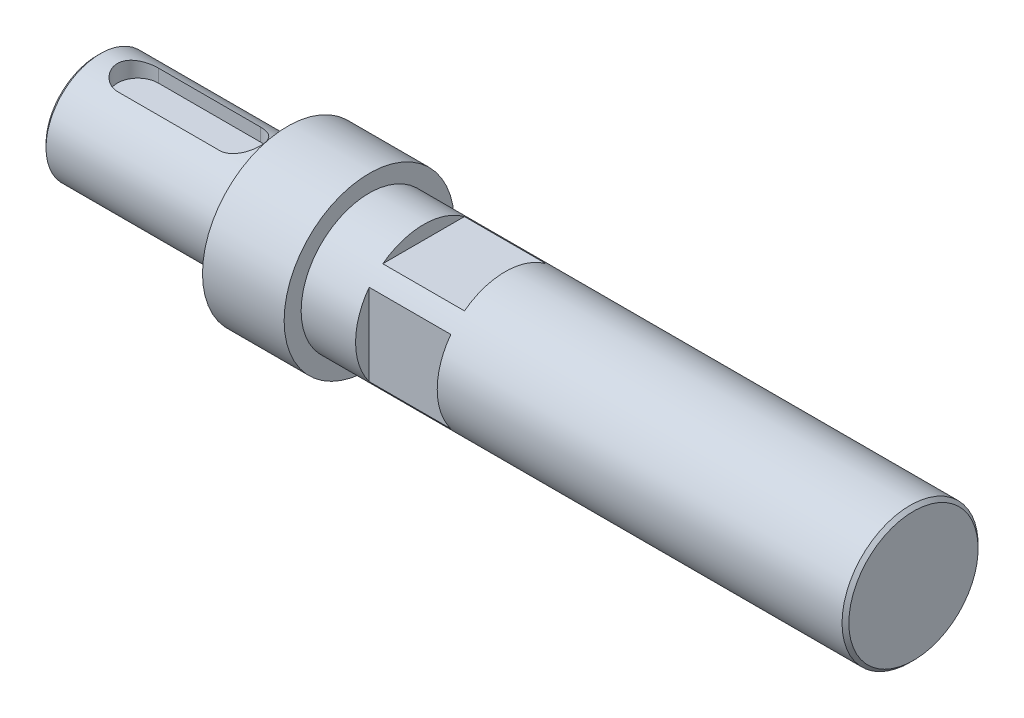
ISO-10303-21;
HEADER;
FILE_DESCRIPTION(('STEP AP214'),'2;1');
FILE_NAME('part.step','',(''),(''),'','','');
FILE_SCHEMA(('AUTOMOTIVE_DESIGN { 1 0 10303 214 1 1 1 1 }'));
ENDSEC;
DATA;
#1=APPLICATION_CONTEXT('core data for automotive mechanical design processes');
#2=APPLICATION_PROTOCOL_DEFINITION('international standard','automotive_design',2000,#1);
#3=PRODUCT_CONTEXT('',#1,'mechanical');
#4=PRODUCT('Part','Part','',(#3));
#5=PRODUCT_RELATED_PRODUCT_CATEGORY('part','',(#4));
#6=PRODUCT_DEFINITION_FORMATION('','',#4);
#7=PRODUCT_DEFINITION_CONTEXT('part definition',#1,'design');
#8=PRODUCT_DEFINITION('design','',#6,#7);
#9=PRODUCT_DEFINITION_SHAPE('','',#8);
#10=(LENGTH_UNIT() NAMED_UNIT(*) SI_UNIT(.MILLI.,.METRE.));
#11=(NAMED_UNIT(*) PLANE_ANGLE_UNIT() SI_UNIT($,.RADIAN.));
#12=(NAMED_UNIT(*) SI_UNIT($,.STERADIAN.) SOLID_ANGLE_UNIT());
#13=UNCERTAINTY_MEASURE_WITH_UNIT(LENGTH_MEASURE(1.E-05),#10,'distance_accuracy_value','');
#14=(GEOMETRIC_REPRESENTATION_CONTEXT(3) GLOBAL_UNCERTAINTY_ASSIGNED_CONTEXT((#13)) GLOBAL_UNIT_ASSIGNED_CONTEXT((#10,
#11,#12)) REPRESENTATION_CONTEXT('',''));
#15=CARTESIAN_POINT('',(0.,0.,0.));
#16=DIRECTION('',(0.,0.,1.));
#17=DIRECTION('',(1.,0.,0.));
#18=AXIS2_PLACEMENT_3D('',#15,#16,#17);
#19=CARTESIAN_POINT('',(0.,0.,0.));
#20=DIRECTION('',(-1.,0.,0.));
#21=DIRECTION('',(0.,0.,1.));
#22=AXIS2_PLACEMENT_3D('',#19,#20,#21);
#23=PLANE('',#22);
#24=CARTESIAN_POINT('',(0.,0.,0.));
#25=DIRECTION('',(-1.,0.,0.));
#26=DIRECTION('',(0.,0.,1.));
#27=AXIS2_PLACEMENT_3D('',#24,#25,#26);
#28=CIRCLE('',#27,19.);
#29=CARTESIAN_POINT('',(0.,0.,19.));
#30=VERTEX_POINT('',#29);
#31=EDGE_CURVE('E197',#30,#30,#28,.T.);
#32=ORIENTED_EDGE('',*,*,#31,.F.);
#33=EDGE_LOOP('',(#32));
#34=FACE_BOUND('',#33,.T.);
#35=ADVANCED_FACE('F35',(#34),#23,.F.);
#36=CARTESIAN_POINT('',(0.,0.,0.));
#37=DIRECTION('',(-1.,0.,0.));
#38=DIRECTION('',(0.,0.,1.));
#39=AXIS2_PLACEMENT_3D('',#36,#37,#38);
#40=CONICAL_SURFACE('',#39,19.,0.785398163397447);
#41=CARTESIAN_POINT('',(-1.,0.,0.));
#42=DIRECTION('',(-1.,0.,0.));
#43=DIRECTION('',(0.,0.,1.));
#44=AXIS2_PLACEMENT_3D('',#41,#42,#43);
#45=CIRCLE('',#44,20.);
#46=CARTESIAN_POINT('',(-1.,0.,20.));
#47=VERTEX_POINT('',#46);
#48=EDGE_CURVE('E194',#47,#47,#45,.T.);
#49=ORIENTED_EDGE('',*,*,#48,.F.);
#50=EDGE_LOOP('',(#49));
#51=FACE_BOUND('',#50,.T.);
#52=ORIENTED_EDGE('',*,*,#31,.T.);
#53=EDGE_LOOP('',(#52));
#54=FACE_BOUND('',#53,.T.);
#55=ADVANCED_FACE('F306',(#51,#54),#40,.T.);
#56=CARTESIAN_POINT('',(-178.322580645161,0.,0.));
#57=DIRECTION('',(-1.,0.,0.));
#58=DIRECTION('',(0.,0.,1.));
#59=AXIS2_PLACEMENT_3D('',#56,#57,#58);
#60=CYLINDRICAL_SURFACE('',#59,20.);
#61=CARTESIAN_POINT('',(-120.,0.,0.));
#62=DIRECTION('',(1.,0.,0.));
#63=DIRECTION('',(0.,0.,-1.));
#64=AXIS2_PLACEMENT_3D('',#61,#62,#63);
#65=CIRCLE('',#64,20.);
#66=CARTESIAN_POINT('',(-120.,-12.,-16.));
#67=VERTEX_POINT('',#66);
#68=CARTESIAN_POINT('',(-120.,12.,-16.));
#69=VERTEX_POINT('',#68);
#70=EDGE_CURVE('E211',#67,#69,#65,.T.);
#71=ORIENTED_EDGE('',*,*,#70,.T.);
#72=DIRECTION('',(-1.,0.,0.));
#73=VECTOR('',#72,1.);
#74=CARTESIAN_POINT('',(-178.322580645161,12.,-16.));
#75=LINE('',#74,#73);
#76=CARTESIAN_POINT('',(-144.,12.,-16.));
#77=VERTEX_POINT('',#76);
#78=EDGE_CURVE('E232',#69,#77,#75,.T.);
#79=ORIENTED_EDGE('',*,*,#78,.T.);
#80=CARTESIAN_POINT('',(-144.,0.,0.));
#81=DIRECTION('',(1.,0.,0.));
#82=DIRECTION('',(0.,0.,-1.));
#83=AXIS2_PLACEMENT_3D('',#80,#81,#82);
#84=CIRCLE('',#83,20.);
#85=CARTESIAN_POINT('',(-144.,-12.,-16.));
#86=VERTEX_POINT('',#85);
#87=EDGE_CURVE('E206',#86,#77,#84,.T.);
#88=ORIENTED_EDGE('',*,*,#87,.F.);
#89=DIRECTION('',(-1.,0.,0.));
#90=VECTOR('',#89,1.);
#91=CARTESIAN_POINT('',(-178.322580645161,-12.,-16.));
#92=LINE('',#91,#90);
#93=EDGE_CURVE('E228',#86,#67,#92,.F.);
#94=ORIENTED_EDGE('',*,*,#93,.T.);
#95=EDGE_LOOP('',(#71,#79,#88,#94));
#96=FACE_BOUND('',#95,.T.);
#97=CARTESIAN_POINT('',(-120.,16.,-12.));
#98=VERTEX_POINT('',#97);
#99=CARTESIAN_POINT('',(-120.,16.,12.));
#100=VERTEX_POINT('',#99);
#101=EDGE_CURVE('E229',#98,#100,#65,.T.);
#102=ORIENTED_EDGE('',*,*,#101,.T.);
#103=DIRECTION('',(-1.,0.,0.));
#104=VECTOR('',#103,1.);
#105=CARTESIAN_POINT('',(-178.322580645161,16.,12.));
#106=LINE('',#105,#104);
#107=CARTESIAN_POINT('',(-144.,16.,12.));
#108=VERTEX_POINT('',#107);
#109=EDGE_CURVE('E225',#100,#108,#106,.T.);
#110=ORIENTED_EDGE('',*,*,#109,.T.);
#111=CARTESIAN_POINT('',(-144.,16.,-12.));
#112=VERTEX_POINT('',#111);
#113=EDGE_CURVE('E224',#112,#108,#84,.T.);
#114=ORIENTED_EDGE('',*,*,#113,.F.);
#115=DIRECTION('',(-1.,0.,0.));
#116=VECTOR('',#115,1.);
#117=CARTESIAN_POINT('',(-178.322580645161,16.,-12.));
#118=LINE('',#117,#116);
#119=EDGE_CURVE('E221',#112,#98,#118,.F.);
#120=ORIENTED_EDGE('',*,*,#119,.T.);
#121=EDGE_LOOP('',(#102,#110,#114,#120));
#122=FACE_BOUND('',#121,.T.);
#123=CARTESIAN_POINT('',(-120.,12.,16.));
#124=VERTEX_POINT('',#123);
#125=CARTESIAN_POINT('',(-120.,-12.,16.));
#126=VERTEX_POINT('',#125);
#127=EDGE_CURVE('E212',#124,#126,#65,.T.);
#128=ORIENTED_EDGE('',*,*,#127,.T.);
#129=DIRECTION('',(-1.,0.,0.));
#130=VECTOR('',#129,1.);
#131=CARTESIAN_POINT('',(-178.322580645161,-12.,16.));
#132=LINE('',#131,#130);
#133=CARTESIAN_POINT('',(-144.,-12.,16.));
#134=VERTEX_POINT('',#133);
#135=EDGE_CURVE('E218',#126,#134,#132,.T.);
#136=ORIENTED_EDGE('',*,*,#135,.T.);
#137=CARTESIAN_POINT('',(-144.,12.,16.));
#138=VERTEX_POINT('',#137);
#139=EDGE_CURVE('E207',#138,#134,#84,.T.);
#140=ORIENTED_EDGE('',*,*,#139,.F.);
#141=DIRECTION('',(-1.,0.,0.));
#142=VECTOR('',#141,1.);
#143=CARTESIAN_POINT('',(-178.322580645161,12.,16.));
#144=LINE('',#143,#142);
#145=EDGE_CURVE('E215',#138,#124,#144,.F.);
#146=ORIENTED_EDGE('',*,*,#145,.T.);
#147=EDGE_LOOP('',(#128,#136,#140,#146));
#148=FACE_BOUND('',#147,.T.);
#149=CARTESIAN_POINT('',(-120.,-16.,12.));
#150=VERTEX_POINT('',#149);
#151=CARTESIAN_POINT('',(-120.,-16.,-12.));
#152=VERTEX_POINT('',#151);
#153=EDGE_CURVE('E205',#150,#152,#65,.T.);
#154=ORIENTED_EDGE('',*,*,#153,.T.);
#155=DIRECTION('',(-1.,0.,0.));
#156=VECTOR('',#155,1.);
#157=CARTESIAN_POINT('',(-178.322580645161,-16.,-12.));
#158=LINE('',#157,#156);
#159=CARTESIAN_POINT('',(-144.,-16.,-12.));
#160=VERTEX_POINT('',#159);
#161=EDGE_CURVE('E210',#152,#160,#158,.T.);
#162=ORIENTED_EDGE('',*,*,#161,.T.);
#163=CARTESIAN_POINT('',(-144.,-16.,12.));
#164=VERTEX_POINT('',#163);
#165=EDGE_CURVE('E203',#164,#160,#84,.T.);
#166=ORIENTED_EDGE('',*,*,#165,.F.);
#167=DIRECTION('',(-1.,0.,0.));
#168=VECTOR('',#167,1.);
#169=CARTESIAN_POINT('',(-178.322580645161,-16.,12.));
#170=LINE('',#169,#168);
#171=EDGE_CURVE('E200',#164,#150,#170,.F.);
#172=ORIENTED_EDGE('',*,*,#171,.T.);
#173=EDGE_LOOP('',(#154,#162,#166,#172));
#174=FACE_BOUND('',#173,.T.);
#175=CARTESIAN_POINT('',(-160.,0.,0.));
#176=DIRECTION('',(-1.,0.,0.));
#177=DIRECTION('',(0.,0.,1.));
#178=AXIS2_PLACEMENT_3D('',#175,#176,#177);
#179=CIRCLE('',#178,20.);
#180=CARTESIAN_POINT('',(-160.,0.,20.));
#181=VERTEX_POINT('',#180);
#182=EDGE_CURVE('E191',#181,#181,#179,.T.);
#183=ORIENTED_EDGE('',*,*,#182,.F.);
#184=EDGE_LOOP('',(#183));
#185=FACE_BOUND('',#184,.T.);
#186=ORIENTED_EDGE('',*,*,#48,.T.);
#187=EDGE_LOOP('',(#186));
#188=FACE_BOUND('',#187,.T.);
#189=ADVANCED_FACE('F311',(#96,#122,#148,#174,#185,#188),#60,.T.);
#190=CARTESIAN_POINT('',(-160.,20.,0.));
#191=DIRECTION('',(-1.,0.,0.));
#192=DIRECTION('',(0.,0.,1.));
#193=AXIS2_PLACEMENT_3D('',#190,#191,#192);
#194=PLANE('',#193);
#195=CARTESIAN_POINT('',(-160.,0.,0.));
#196=DIRECTION('',(-1.,0.,0.));
#197=DIRECTION('',(0.,0.,1.));
#198=AXIS2_PLACEMENT_3D('',#195,#196,#197);
#199=CIRCLE('',#198,25.);
#200=CARTESIAN_POINT('',(-160.,0.,25.));
#201=VERTEX_POINT('',#200);
#202=EDGE_CURVE('E188',#201,#201,#199,.T.);
#203=ORIENTED_EDGE('',*,*,#202,.F.);
#204=EDGE_LOOP('',(#203));
#205=FACE_BOUND('',#204,.T.);
#206=ORIENTED_EDGE('',*,*,#182,.T.);
#207=EDGE_LOOP('',(#206));
#208=FACE_BOUND('',#207,.T.);
#209=ADVANCED_FACE('F318',(#205,#208),#194,.F.);
#210=CARTESIAN_POINT('',(-178.322580645161,0.,0.));
#211=DIRECTION('',(-1.,0.,0.));
#212=DIRECTION('',(0.,0.,1.));
#213=AXIS2_PLACEMENT_3D('',#210,#211,#212);
#214=CYLINDRICAL_SURFACE('',#213,25.);
#215=CARTESIAN_POINT('',(-184.,0.,0.));
#216=DIRECTION('',(-1.,0.,0.));
#217=DIRECTION('',(0.,0.,1.));
#218=AXIS2_PLACEMENT_3D('',#215,#216,#217);
#219=CIRCLE('',#218,25.);
#220=CARTESIAN_POINT('',(-184.,0.,25.));
#221=VERTEX_POINT('',#220);
#222=EDGE_CURVE('E185',#221,#221,#219,.T.);
#223=ORIENTED_EDGE('',*,*,#222,.F.);
#224=EDGE_LOOP('',(#223));
#225=FACE_BOUND('',#224,.T.);
#226=ORIENTED_EDGE('',*,*,#202,.T.);
#227=EDGE_LOOP('',(#226));
#228=FACE_BOUND('',#227,.T.);
#229=ADVANCED_FACE('F325',(#225,#228),#214,.T.);
#230=CARTESIAN_POINT('',(-184.,25.,0.));
#231=DIRECTION('',(1.,0.,0.));
#232=DIRECTION('',(0.,0.,-1.));
#233=AXIS2_PLACEMENT_3D('',#230,#231,#232);
#234=PLANE('',#233);
#235=CARTESIAN_POINT('',(-184.,0.,0.));
#236=DIRECTION('',(-1.,0.,0.));
#237=DIRECTION('',(0.,0.,1.));
#238=AXIS2_PLACEMENT_3D('',#235,#236,#237);
#239=CIRCLE('',#238,16.);
#240=CARTESIAN_POINT('',(-184.,0.,16.));
#241=VERTEX_POINT('',#240);
#242=EDGE_CURVE('E182',#241,#241,#239,.T.);
#243=ORIENTED_EDGE('',*,*,#242,.F.);
#244=EDGE_LOOP('',(#243));
#245=FACE_BOUND('',#244,.T.);
#246=ORIENTED_EDGE('',*,*,#222,.T.);
#247=EDGE_LOOP('',(#246));
#248=FACE_BOUND('',#247,.T.);
#249=ADVANCED_FACE('F301',(#245,#248),#234,.F.);
#250=CARTESIAN_POINT('',(-178.322580645161,0.,0.));
#251=DIRECTION('',(-1.,0.,0.));
#252=DIRECTION('',(0.,0.,1.));
#253=AXIS2_PLACEMENT_3D('',#250,#251,#252);
#254=CYLINDRICAL_SURFACE('',#253,16.);
#255=DIRECTION('',(-1.,0.,0.));
#256=VECTOR('',#255,1.);
#257=CARTESIAN_POINT('',(-178.322580645161,14.8323969741913,-6.));
#258=LINE('',#257,#256);
#259=CARTESIAN_POINT('',(-228.,14.8323969741913,-6.));
#260=VERTEX_POINT('',#259);
#261=CARTESIAN_POINT('',(-198.,14.8323969741913,-6.));
#262=VERTEX_POINT('',#261);
#263=EDGE_CURVE('E12',#260,#262,#258,.F.);
#264=ORIENTED_EDGE('',*,*,#263,.T.);
#265=CARTESIAN_POINT('',(-198.,14.8323969741913,-6.));
#266=CARTESIAN_POINT('',(-197.837677983405,14.8323657769004,-6.00002462890763));
#267=CARTESIAN_POINT('',(-197.67536833654,14.8350605511288,-5.99341404654891));
#268=CARTESIAN_POINT('',(-197.35203779938,14.8456729077173,-5.96710689663442));
#269=CARTESIAN_POINT('',(-197.191016494741,14.853588736481,-5.94741472277883));
#270=CARTESIAN_POINT('',(-196.871982160078,14.8743774637201,-5.89522121489212));
#271=CARTESIAN_POINT('',(-196.713960493769,14.8872327019582,-5.86276550567331));
#272=CARTESIAN_POINT('',(-196.401445145534,14.9174797551924,-5.78537234438866));
#273=CARTESIAN_POINT('',(-196.246951643472,14.9348718009118,-5.74043425751329));
#274=CARTESIAN_POINT('',(-195.942693586765,14.9736354080051,-5.63854621321915));
#275=CARTESIAN_POINT('',(-195.792923939472,14.9950024996505,-5.58160973789903));
#276=CARTESIAN_POINT('',(-195.498796870563,15.0411073171702,-5.45614850704767));
#277=CARTESIAN_POINT('',(-195.354441501941,15.0658463054533,-5.38761940901067));
#278=CARTESIAN_POINT('',(-195.071972365105,15.1180047141692,-5.23947509623674));
#279=CARTESIAN_POINT('',(-194.933861111055,15.1454252004838,-5.15985546768996));
#280=CARTESIAN_POINT('',(-194.664642186601,15.2022132583195,-4.99006275732568));
#281=CARTESIAN_POINT('',(-194.533537076828,15.2315815330554,-4.89988585490083));
#282=CARTESIAN_POINT('',(-194.273367959497,15.2928444944057,-4.70529167471344));
#283=CARTESIAN_POINT('',(-194.144658217283,15.3247934233104,-4.60041755502683));
#284=CARTESIAN_POINT('',(-193.896422865584,15.3891185764833,-4.38042926866255));
#285=CARTESIAN_POINT('',(-193.776897484667,15.4214948113621,-4.26531484729181));
#286=CARTESIAN_POINT('',(-193.547690646357,15.4858307153072,-4.02547696723541));
#287=CARTESIAN_POINT('',(-193.438012791249,15.5177902283091,-3.900750022985));
#288=CARTESIAN_POINT('',(-193.229269706853,15.5804350582102,-3.64248429877081));
#289=CARTESIAN_POINT('',(-193.130200808049,15.6111208134239,-3.50894859165119));
#290=CARTESIAN_POINT('',(-192.940066423207,15.6714555396213,-3.22903626763276));
#291=CARTESIAN_POINT('',(-192.849395721764,15.7010320583688,-3.08237539728755));
#292=CARTESIAN_POINT('',(-192.680833791352,15.7571321291623,-2.78140375594473));
#293=CARTESIAN_POINT('',(-192.602937352656,15.7836569244686,-2.62709613712155));
#294=CARTESIAN_POINT('',(-192.460550009194,15.8329100734429,-2.31179962187087));
#295=CARTESIAN_POINT('',(-192.396060882203,15.8556379235672,-2.1508098427965));
#296=CARTESIAN_POINT('',(-192.281148962322,15.8966151761394,-1.82340996808265));
#297=CARTESIAN_POINT('',(-192.230719543464,15.9148666876771,-1.657002467106));
#298=CARTESIAN_POINT('',(-192.146259195995,15.9456829024206,-1.32719455831967));
#299=CARTESIAN_POINT('',(-192.111619620438,15.9584572838872,-1.16396950802629));
#300=CARTESIAN_POINT('',(-192.056040066353,15.9790485249461,-0.834960885906341));
#301=CARTESIAN_POINT('',(-192.035094241083,15.9868675002756,-0.669178436986102));
#302=CARTESIAN_POINT('',(-192.007103653497,15.9973322114061,-0.336291009707984));
#303=CARTESIAN_POINT('',(-192.000058058254,15.999978257178,-0.169186111196078));
#304=CARTESIAN_POINT('',(-191.999942662582,16.0000214725095,0.165026761421433));
#305=CARTESIAN_POINT('',(-192.006872439644,15.9974188007506,0.332134735281328));
#306=CARTESIAN_POINT('',(-192.033939006798,15.9872992698175,0.656742258063061));
#307=CARTESIAN_POINT('',(-192.053401914234,15.98003321491,0.814306383911218));
#308=CARTESIAN_POINT('',(-192.104697732925,15.9610156715413,1.12718686503735));
#309=CARTESIAN_POINT('',(-192.136534783018,15.9492626823372,1.28250245018736));
#310=CARTESIAN_POINT('',(-192.212270952541,15.9215755211723,1.58972181255219));
#311=CARTESIAN_POINT('',(-192.2561659443,15.9056427801065,1.74162673808861));
#312=CARTESIAN_POINT('',(-192.355658020798,15.8699855127055,2.04115617964515));
#313=CARTESIAN_POINT('',(-192.41125953925,15.8502595499765,2.18877904971447));
#314=CARTESIAN_POINT('',(-192.534571427046,15.8071985348799,2.48084105948607));
#315=CARTESIAN_POINT('',(-192.602442155489,15.7838163195942,2.6252054860608));
#316=CARTESIAN_POINT('',(-192.749249014876,15.7342178978561,2.90774301115977));
#317=CARTESIAN_POINT('',(-192.828188918147,15.7080007259628,3.04591397770582));
#318=CARTESIAN_POINT('',(-192.996571371941,15.6533688738254,3.31525705021108));
#319=CARTESIAN_POINT('',(-193.086014868124,15.624953995796,3.44642852444263));
#320=CARTESIAN_POINT('',(-193.274828620181,15.5666047702851,3.7010648643827));
#321=CARTESIAN_POINT('',(-193.3741993357,15.5366703524782,3.82452937281617));
#322=CARTESIAN_POINT('',(-193.588388226248,15.4742114423974,4.07010566772363));
#323=CARTESIAN_POINT('',(-193.703770566381,15.4416380087227,4.19171346605532));
#324=CARTESIAN_POINT('',(-193.944256076059,15.3764647713588,4.42481373672158));
#325=CARTESIAN_POINT('',(-194.0693563136,15.3438649785375,4.53630923821829));
#326=CARTESIAN_POINT('',(-194.328674381928,15.2794910965701,4.74862817180573));
#327=CARTESIAN_POINT('',(-194.462899056426,15.2477176524747,4.84944344499896));
#328=CARTESIAN_POINT('',(-194.73954676761,15.1859272618475,5.03960389178667));
#329=CARTESIAN_POINT('',(-194.881966584686,15.155909634732,5.12895352590132));
#330=CARTESIAN_POINT('',(-195.177607612415,15.0978281177504,5.29752029811559));
#331=CARTESIAN_POINT('',(-195.331002853558,15.0698257865309,5.37645394970005));
#332=CARTESIAN_POINT('',(-195.644477849349,15.0174770863341,5.52098638459548));
#333=CARTESIAN_POINT('',(-195.804554724099,14.9931291626221,5.58659084291673));
#334=CARTESIAN_POINT('',(-196.130143034837,14.9489262485012,5.70381737560501));
#335=CARTESIAN_POINT('',(-196.295647865456,14.9290660134625,5.75545578573179));
#336=CARTESIAN_POINT('',(-196.630943689617,14.8945125693948,5.84429251034815));
#337=CARTESIAN_POINT('',(-196.800732711831,14.8798170287289,5.88149734176583));
#338=CARTESIAN_POINT('',(-197.141467083624,14.8562643613127,5.94074704634339));
#339=CARTESIAN_POINT('',(-197.312380837865,14.8473466961489,5.96294922108734));
#340=CARTESIAN_POINT('',(-197.655524729197,14.8353960927941,5.99258426428986));
#341=CARTESIAN_POINT('',(-197.827753493056,14.8323576853049,6.00003085957946));
#342=CARTESIAN_POINT('',(-198.,14.8323969741913,6.));
#343=B_SPLINE_CURVE_WITH_KNOTS('',3,(#265,#266,#267,#268,#269,#270,#271,#272,#273,#274,#275,
#276,#277,#278,#279,#280,#281,#282,#283,#284,#285,#286,#287,#288,#289,#290,#291,#292,#293,#294,
#295,#296,#297,#298,#299,#300,#301,#302,#303,#304,#305,#306,#307,#308,#309,#310,#311,#312,#313,
#314,#315,#316,#317,#318,#319,#320,#321,#322,#323,#324,#325,#326,#327,#328,#329,#330,#331,#332,
#333,#334,#335,#336,#337,#338,#339,#340,#341,#342),.UNSPECIFIED.,.F.,.F.,(4,2,2,2,2,2,2,2,2,2,2,
2,2,2,2,2,2,2,2,2,2,2,2,2,2,2,2,2,2,2,2,2,2,2,2,2,2,2,4),(0.,0.486789862688229,
0.973416310392244,1.45831883733165,1.94324602921257,2.42763120628518,2.91219823368463,
3.39695866303148,3.88189506943072,4.38854574854312,4.89520903241171,5.40205690806532,
5.90872890073298,6.43290668009678,6.95687014958035,7.48090305106119,8.00468857069212,
8.50609203497523,9.0072812778817,9.50844048774321,10.0095845465658,10.4858081519302,
10.9621911793194,11.4384113342093,11.9148121775972,12.3979609457915,12.8812747710129,
13.3646321434047,13.8480119063812,14.3597405189261,14.8713153321613,15.3832781742801,
15.8950412378444,16.418688710306,16.9421127663223,17.46492191135,17.9874947264918,
18.5044996717035,19.0210234309607),.UNSPECIFIED.);
#344=CARTESIAN_POINT('',(-198.,14.8323969741913,6.));
#345=VERTEX_POINT('',#344);
#346=EDGE_CURVE('E235',#262,#345,#343,.T.);
#347=ORIENTED_EDGE('',*,*,#346,.T.);
#348=DIRECTION('',(-1.,0.,0.));
#349=VECTOR('',#348,1.);
#350=CARTESIAN_POINT('',(-178.322580645161,14.8323969741913,6.));
#351=LINE('',#350,#349);
#352=CARTESIAN_POINT('',(-228.,14.8323969741913,6.));
#353=VERTEX_POINT('',#352);
#354=EDGE_CURVE('E42',#345,#353,#351,.T.);
#355=ORIENTED_EDGE('',*,*,#354,.T.);
#356=CARTESIAN_POINT('',(-228.,14.8323969741913,6.));
#357=CARTESIAN_POINT('',(-228.162322016595,14.8323657769004,6.00002462890763));
#358=CARTESIAN_POINT('',(-228.32463166346,14.8350605511288,5.99341404654891));
#359=CARTESIAN_POINT('',(-228.64796220062,14.8456729077173,5.96710689663442));
#360=CARTESIAN_POINT('',(-228.808983505259,14.853588736481,5.94741472277883));
#361=CARTESIAN_POINT('',(-229.128017839922,14.8743774637201,5.89522121489211));
#362=CARTESIAN_POINT('',(-229.286039506231,14.8872327019582,5.86276550567331));
#363=CARTESIAN_POINT('',(-229.598554854465,14.9174797551924,5.78537234438866));
#364=CARTESIAN_POINT('',(-229.753048356528,14.9348718009118,5.7404342575133));
#365=CARTESIAN_POINT('',(-230.057306413235,14.9736354080051,5.63854621321916));
#366=CARTESIAN_POINT('',(-230.207076060528,14.9950024996505,5.58160973789903));
#367=CARTESIAN_POINT('',(-230.501203129437,15.0411073171702,5.45614850704768));
#368=CARTESIAN_POINT('',(-230.645558498059,15.0658463054533,5.38761940901069));
#369=CARTESIAN_POINT('',(-230.928027634894,15.1180047141692,5.23947509623675));
#370=CARTESIAN_POINT('',(-231.066138888945,15.1454252004837,5.15985546768997));
#371=CARTESIAN_POINT('',(-231.335357813399,15.2022132583195,4.99006275732569));
#372=CARTESIAN_POINT('',(-231.466462923172,15.2315815330554,4.89988585490084));
#373=CARTESIAN_POINT('',(-231.726632040502,15.2928444944057,4.70529167471344));
#374=CARTESIAN_POINT('',(-231.855341782717,15.3247934233104,4.60041755502683));
#375=CARTESIAN_POINT('',(-232.103577134416,15.3891185764833,4.38042926866254));
#376=CARTESIAN_POINT('',(-232.223102515333,15.4214948113621,4.26531484729181));
#377=CARTESIAN_POINT('',(-232.452309353643,15.4858307153072,4.02547696723541));
#378=CARTESIAN_POINT('',(-232.561987208751,15.5177902283091,3.900750022985));
#379=CARTESIAN_POINT('',(-232.770730293147,15.5804350582102,3.64248429877082));
#380=CARTESIAN_POINT('',(-232.869799191951,15.6111208134239,3.50894859165119));
#381=CARTESIAN_POINT('',(-233.059933576793,15.6714555396213,3.22903626763276));
#382=CARTESIAN_POINT('',(-233.150604278236,15.7010320583688,3.08237539728754));
#383=CARTESIAN_POINT('',(-233.319166208648,15.7571321291623,2.78140375594472));
#384=CARTESIAN_POINT('',(-233.397062647344,15.7836569244686,2.62709613712154));
#385=CARTESIAN_POINT('',(-233.539449990806,15.8329100734429,2.31179962187087));
#386=CARTESIAN_POINT('',(-233.603939117797,15.8556379235672,2.15080984279651));
#387=CARTESIAN_POINT('',(-233.718851037678,15.8966151761394,1.82340996808265));
#388=CARTESIAN_POINT('',(-233.769280456536,15.9148666876771,1.657002467106));
#389=CARTESIAN_POINT('',(-233.853740804005,15.9456829024206,1.32719455831967));
#390=CARTESIAN_POINT('',(-233.888380379562,15.9584572838872,1.16396950802629));
#391=CARTESIAN_POINT('',(-233.943959933647,15.9790485249461,0.83496088590634));
#392=CARTESIAN_POINT('',(-233.964905758917,15.9868675002756,0.669178436986102));
#393=CARTESIAN_POINT('',(-233.992896346503,15.9973322114061,0.336291009707985));
#394=CARTESIAN_POINT('',(-233.999941941746,15.999978257178,0.16918611119608));
#395=CARTESIAN_POINT('',(-234.000057337418,16.0000214725095,-0.165026761421432));
#396=CARTESIAN_POINT('',(-233.993127560356,15.9974188007506,-0.332134735281327));
#397=CARTESIAN_POINT('',(-233.966060993202,15.9872992698175,-0.656742258063061));
#398=CARTESIAN_POINT('',(-233.946598085766,15.98003321491,-0.814306383911219));
#399=CARTESIAN_POINT('',(-233.895302267075,15.9610156715413,-1.12718686503735));
#400=CARTESIAN_POINT('',(-233.863465216982,15.9492626823372,-1.28250245018736));
#401=CARTESIAN_POINT('',(-233.787729047459,15.9215755211723,-1.5897218125522));
#402=CARTESIAN_POINT('',(-233.7438340557,15.9056427801065,-1.74162673808861));
#403=CARTESIAN_POINT('',(-233.644341979202,15.8699855127055,-2.04115617964515));
#404=CARTESIAN_POINT('',(-233.58874046075,15.8502595499765,-2.18877904971448));
#405=CARTESIAN_POINT('',(-233.465428572954,15.8071985348799,-2.48084105948607));
#406=CARTESIAN_POINT('',(-233.397557844511,15.7838163195942,-2.6252054860608));
#407=CARTESIAN_POINT('',(-233.250750985124,15.7342178978561,-2.90774301115977));
#408=CARTESIAN_POINT('',(-233.171811081853,15.7080007259628,-3.04591397770582));
#409=CARTESIAN_POINT('',(-233.003428628059,15.6533688738254,-3.31525705021108));
#410=CARTESIAN_POINT('',(-232.913985131876,15.624953995796,-3.44642852444264));
#411=CARTESIAN_POINT('',(-232.725171379819,15.5666047702851,-3.7010648643827));
#412=CARTESIAN_POINT('',(-232.6258006643,15.5366703524781,-3.82452937281617));
#413=CARTESIAN_POINT('',(-232.411611773752,15.4742114423974,-4.07010566772363));
#414=CARTESIAN_POINT('',(-232.296229433619,15.4416380087227,-4.19171346605532));
#415=CARTESIAN_POINT('',(-232.055743923941,15.3764647713588,-4.42481373672158));
#416=CARTESIAN_POINT('',(-231.9306436864,15.3438649785375,-4.53630923821829));
#417=CARTESIAN_POINT('',(-231.671325618072,15.2794910965702,-4.74862817180572));
#418=CARTESIAN_POINT('',(-231.537100943574,15.2477176524747,-4.84944344499894));
#419=CARTESIAN_POINT('',(-231.26045323239,15.1859272618475,-5.03960389178665));
#420=CARTESIAN_POINT('',(-231.118033415314,15.155909634732,-5.12895352590132));
#421=CARTESIAN_POINT('',(-230.822392387585,15.0978281177504,-5.29752029811557));
#422=CARTESIAN_POINT('',(-230.668997146442,15.0698257865309,-5.37645394970002));
#423=CARTESIAN_POINT('',(-230.355522150651,15.0174770863341,-5.52098638459545));
#424=CARTESIAN_POINT('',(-230.195445275901,14.9931291626221,-5.5865908429167));
#425=CARTESIAN_POINT('',(-229.869856965163,14.9489262485012,-5.70381737560499));
#426=CARTESIAN_POINT('',(-229.704352134544,14.9290660134626,-5.75545578573178));
#427=CARTESIAN_POINT('',(-229.369056310383,14.8945125693948,-5.84429251034814));
#428=CARTESIAN_POINT('',(-229.199267288169,14.8798170287289,-5.88149734176583));
#429=CARTESIAN_POINT('',(-228.858532916376,14.8562643613127,-5.94074704634339));
#430=CARTESIAN_POINT('',(-228.687619162135,14.8473466961489,-5.96294922108734));
#431=CARTESIAN_POINT('',(-228.344475270803,14.8353960927941,-5.99258426428986));
#432=CARTESIAN_POINT('',(-228.172246506944,14.8323576853049,-6.00003085957946));
#433=CARTESIAN_POINT('',(-228.,14.8323969741913,-6.));
#434=B_SPLINE_CURVE_WITH_KNOTS('',3,(#356,#357,#358,#359,#360,#361,#362,#363,#364,#365,#366,
#367,#368,#369,#370,#371,#372,#373,#374,#375,#376,#377,#378,#379,#380,#381,#382,#383,#384,#385,
#386,#387,#388,#389,#390,#391,#392,#393,#394,#395,#396,#397,#398,#399,#400,#401,#402,#403,#404,
#405,#406,#407,#408,#409,#410,#411,#412,#413,#414,#415,#416,#417,#418,#419,#420,#421,#422,#423,
#424,#425,#426,#427,#428,#429,#430,#431,#432,#433),.UNSPECIFIED.,.F.,.F.,(4,2,2,2,2,2,2,2,2,2,2,
2,2,2,2,2,2,2,2,2,2,2,2,2,2,2,2,2,2,2,2,2,2,2,2,2,2,2,4),(0.,0.486789862688229,
0.973416310392272,1.45831883733162,1.94324602921257,2.42763120628515,2.9121982336846,
3.39695866303144,3.88189506943072,4.38854574854313,4.89520903241171,5.40205690806529,
5.90872890073297,6.43290668009679,6.95687014958035,7.48090305106119,8.00468857069212,
8.50609203497523,9.0072812778817,9.5084404877432,10.0095845465658,10.4858081519302,
10.9621911793194,11.4384113342093,11.9148121775972,12.3979609457915,12.8812747710129,
13.3646321434047,13.8480119063812,14.3597405189261,14.8713153321613,15.38327817428,
15.8950412378444,16.418688710306,16.9421127663222,17.46492191135,17.9874947264917,
18.5044996717035,19.0210234309607),.UNSPECIFIED.);
#435=EDGE_CURVE('E49',#353,#260,#434,.T.);
#436=ORIENTED_EDGE('',*,*,#435,.T.);
#437=EDGE_LOOP('',(#264,#347,#355,#436));
#438=FACE_BOUND('',#437,.T.);
#439=CARTESIAN_POINT('',(-239.,0.,0.));
#440=DIRECTION('',(-1.,0.,0.));
#441=DIRECTION('',(0.,0.,1.));
#442=AXIS2_PLACEMENT_3D('',#439,#440,#441);
#443=CIRCLE('',#442,16.);
#444=CARTESIAN_POINT('',(-239.,0.,16.));
#445=VERTEX_POINT('',#444);
#446=EDGE_CURVE('E179',#445,#445,#443,.T.);
#447=ORIENTED_EDGE('',*,*,#446,.F.);
#448=EDGE_LOOP('',(#447));
#449=FACE_BOUND('',#448,.T.);
#450=ORIENTED_EDGE('',*,*,#242,.T.);
#451=EDGE_LOOP('',(#450));
#452=FACE_BOUND('',#451,.T.);
#453=ADVANCED_FACE('F247',(#438,#449,#452),#254,.T.);
#454=CARTESIAN_POINT('',(-239.,0.,0.));
#455=DIRECTION('',(1.,0.,0.));
#456=DIRECTION('',(0.,0.,-1.));
#457=AXIS2_PLACEMENT_3D('',#454,#455,#456);
#458=CONICAL_SURFACE('',#457,16.,0.785398163397446);
#459=CARTESIAN_POINT('',(-240.,0.,0.));
#460=DIRECTION('',(-1.,0.,0.));
#461=DIRECTION('',(0.,0.,1.));
#462=AXIS2_PLACEMENT_3D('',#459,#460,#461);
#463=CIRCLE('',#462,15.);
#464=CARTESIAN_POINT('',(-240.,0.,15.));
#465=VERTEX_POINT('',#464);
#466=EDGE_CURVE('E166',#465,#465,#463,.T.);
#467=ORIENTED_EDGE('',*,*,#466,.F.);
#468=EDGE_LOOP('',(#467));
#469=FACE_BOUND('',#468,.T.);
#470=ORIENTED_EDGE('',*,*,#446,.T.);
#471=EDGE_LOOP('',(#470));
#472=FACE_BOUND('',#471,.T.);
#473=ADVANCED_FACE('F294',(#469,#472),#458,.T.);
#474=CARTESIAN_POINT('',(-240.,15.,0.));
#475=DIRECTION('',(1.,0.,0.));
#476=DIRECTION('',(0.,0.,-1.));
#477=AXIS2_PLACEMENT_3D('',#474,#475,#476);
#478=PLANE('',#477);
#479=ORIENTED_EDGE('',*,*,#466,.T.);
#480=EDGE_LOOP('',(#479));
#481=FACE_BOUND('',#480,.T.);
#482=ADVANCED_FACE('F268',(#481),#478,.F.);
#483=CARTESIAN_POINT('',(-120.,-16.,16.));
#484=DIRECTION('',(0.,1.,0.));
#485=DIRECTION('',(0.,0.,1.));
#486=AXIS2_PLACEMENT_3D('',#483,#484,#485);
#487=PLANE('',#486);
#488=DIRECTION('',(0.,0.,-1.));
#489=VECTOR('',#488,1.);
#490=CARTESIAN_POINT('',(-120.,-16.,16.));
#491=LINE('',#490,#489);
#492=EDGE_CURVE('E163',#150,#152,#491,.T.);
#493=ORIENTED_EDGE('',*,*,#492,.F.);
#494=ORIENTED_EDGE('',*,*,#171,.F.);
#495=DIRECTION('',(0.,0.,-1.));
#496=VECTOR('',#495,1.);
#497=CARTESIAN_POINT('',(-144.,-16.,16.));
#498=LINE('',#497,#496);
#499=EDGE_CURVE('E157',#164,#160,#498,.T.);
#500=ORIENTED_EDGE('',*,*,#499,.T.);
#501=ORIENTED_EDGE('',*,*,#161,.F.);
#502=EDGE_LOOP('',(#493,#494,#500,#501));
#503=FACE_BOUND('',#502,.T.);
#504=ADVANCED_FACE('F264',(#503),#487,.F.);
#505=CARTESIAN_POINT('',(-144.,0.,0.));
#506=DIRECTION('',(1.,0.,0.));
#507=DIRECTION('',(0.,0.,-1.));
#508=AXIS2_PLACEMENT_3D('',#505,#506,#507);
#509=PLANE('',#508);
#510=ORIENTED_EDGE('',*,*,#165,.T.);
#511=ORIENTED_EDGE('',*,*,#499,.F.);
#512=EDGE_LOOP('',(#510,#511));
#513=FACE_BOUND('',#512,.T.);
#514=ADVANCED_FACE('F267',(#513),#509,.T.);
#515=CARTESIAN_POINT('',(-120.,0.,0.));
#516=DIRECTION('',(1.,0.,0.));
#517=DIRECTION('',(0.,0.,-1.));
#518=AXIS2_PLACEMENT_3D('',#515,#516,#517);
#519=PLANE('',#518);
#520=ORIENTED_EDGE('',*,*,#492,.T.);
#521=ORIENTED_EDGE('',*,*,#153,.F.);
#522=EDGE_LOOP('',(#520,#521));
#523=FACE_BOUND('',#522,.T.);
#524=ADVANCED_FACE('F274',(#523),#519,.F.);
#525=CARTESIAN_POINT('',(-120.,-16.,16.));
#526=DIRECTION('',(0.,0.,-1.));
#527=DIRECTION('',(-1.,0.,0.));
#528=AXIS2_PLACEMENT_3D('',#525,#526,#527);
#529=PLANE('',#528);
#530=DIRECTION('',(0.,-1.,0.));
#531=VECTOR('',#530,1.);
#532=CARTESIAN_POINT('',(-120.,-16.,16.));
#533=LINE('',#532,#531);
#534=EDGE_CURVE('E160',#124,#126,#533,.T.);
#535=ORIENTED_EDGE('',*,*,#534,.F.);
#536=ORIENTED_EDGE('',*,*,#145,.F.);
#537=DIRECTION('',(0.,-1.,0.));
#538=VECTOR('',#537,1.);
#539=CARTESIAN_POINT('',(-144.,-16.,16.));
#540=LINE('',#539,#538);
#541=EDGE_CURVE('E172',#138,#134,#540,.T.);
#542=ORIENTED_EDGE('',*,*,#541,.T.);
#543=ORIENTED_EDGE('',*,*,#135,.F.);
#544=EDGE_LOOP('',(#535,#536,#542,#543));
#545=FACE_BOUND('',#544,.T.);
#546=ADVANCED_FACE('F270',(#545),#529,.F.);
#547=ORIENTED_EDGE('',*,*,#139,.T.);
#548=ORIENTED_EDGE('',*,*,#541,.F.);
#549=EDGE_LOOP('',(#547,#548));
#550=FACE_BOUND('',#549,.T.);
#551=ADVANCED_FACE('F273',(#550),#509,.T.);
#552=ORIENTED_EDGE('',*,*,#534,.T.);
#553=ORIENTED_EDGE('',*,*,#127,.F.);
#554=EDGE_LOOP('',(#552,#553));
#555=FACE_BOUND('',#554,.T.);
#556=ADVANCED_FACE('F280',(#555),#519,.F.);
#557=CARTESIAN_POINT('',(-120.,16.,16.));
#558=DIRECTION('',(0.,-1.,0.));
#559=DIRECTION('',(0.,0.,-1.));
#560=AXIS2_PLACEMENT_3D('',#557,#558,#559);
#561=PLANE('',#560);
#562=DIRECTION('',(0.,0.,1.));
#563=VECTOR('',#562,1.);
#564=CARTESIAN_POINT('',(-120.,16.,16.));
#565=LINE('',#564,#563);
#566=EDGE_CURVE('E156',#98,#100,#565,.T.);
#567=ORIENTED_EDGE('',*,*,#566,.F.);
#568=ORIENTED_EDGE('',*,*,#119,.F.);
#569=DIRECTION('',(0.,0.,1.));
#570=VECTOR('',#569,1.);
#571=CARTESIAN_POINT('',(-144.,16.,16.));
#572=LINE('',#571,#570);
#573=EDGE_CURVE('E169',#112,#108,#572,.T.);
#574=ORIENTED_EDGE('',*,*,#573,.T.);
#575=ORIENTED_EDGE('',*,*,#109,.F.);
#576=EDGE_LOOP('',(#567,#568,#574,#575));
#577=FACE_BOUND('',#576,.T.);
#578=ADVANCED_FACE('F276',(#577),#561,.F.);
#579=ORIENTED_EDGE('',*,*,#113,.T.);
#580=ORIENTED_EDGE('',*,*,#573,.F.);
#581=EDGE_LOOP('',(#579,#580));
#582=FACE_BOUND('',#581,.T.);
#583=ADVANCED_FACE('F279',(#582),#509,.T.);
#584=ORIENTED_EDGE('',*,*,#566,.T.);
#585=ORIENTED_EDGE('',*,*,#101,.F.);
#586=EDGE_LOOP('',(#584,#585));
#587=FACE_BOUND('',#586,.T.);
#588=ADVANCED_FACE('F285',(#587),#519,.F.);
#589=DIRECTION('',(0.,1.,0.));
#590=VECTOR('',#589,1.);
#591=CARTESIAN_POINT('',(-120.,-16.,-16.));
#592=LINE('',#591,#590);
#593=EDGE_CURVE('E57',#67,#69,#592,.T.);
#594=ORIENTED_EDGE('',*,*,#593,.T.);
#595=ORIENTED_EDGE('',*,*,#70,.F.);
#596=EDGE_LOOP('',(#594,#595));
#597=FACE_BOUND('',#596,.T.);
#598=ADVANCED_FACE('F288',(#597),#519,.F.);
#599=ORIENTED_EDGE('',*,*,#87,.T.);
#600=DIRECTION('',(0.,1.,0.));
#601=VECTOR('',#600,1.);
#602=CARTESIAN_POINT('',(-144.,-16.,-16.));
#603=LINE('',#602,#601);
#604=EDGE_CURVE('E150',#86,#77,#603,.T.);
#605=ORIENTED_EDGE('',*,*,#604,.F.);
#606=EDGE_LOOP('',(#599,#605));
#607=FACE_BOUND('',#606,.T.);
#608=ADVANCED_FACE('F284',(#607),#509,.T.);
#609=CARTESIAN_POINT('',(-120.,-16.,-16.));
#610=DIRECTION('',(0.,0.,1.));
#611=DIRECTION('',(1.,0.,0.));
#612=AXIS2_PLACEMENT_3D('',#609,#610,#611);
#613=PLANE('',#612);
#614=ORIENTED_EDGE('',*,*,#593,.F.);
#615=ORIENTED_EDGE('',*,*,#93,.F.);
#616=ORIENTED_EDGE('',*,*,#604,.T.);
#617=ORIENTED_EDGE('',*,*,#78,.F.);
#618=EDGE_LOOP('',(#614,#615,#616,#617));
#619=FACE_BOUND('',#618,.T.);
#620=ADVANCED_FACE('F263',(#619),#613,.F.);
#621=CARTESIAN_POINT('',(-228.,11.,0.));
#622=DIRECTION('',(0.,1.,0.));
#623=DIRECTION('',(0.,0.,1.));
#624=AXIS2_PLACEMENT_3D('',#621,#622,#623);
#625=CYLINDRICAL_SURFACE('',#624,6.);
#626=DIRECTION('',(0.,1.,0.));
#627=VECTOR('',#626,1.);
#628=CARTESIAN_POINT('',(-228.,11.,6.));
#629=LINE('',#628,#627);
#630=CARTESIAN_POINT('',(-228.,11.,6.));
#631=VERTEX_POINT('',#630);
#632=EDGE_CURVE('E122',#631,#353,#629,.T.);
#633=ORIENTED_EDGE('',*,*,#632,.F.);
#634=CARTESIAN_POINT('',(-228.,11.,0.));
#635=DIRECTION('',(0.,1.,0.));
#636=DIRECTION('',(0.,0.,1.));
#637=AXIS2_PLACEMENT_3D('',#634,#635,#636);
#638=CIRCLE('',#637,6.);
#639=CARTESIAN_POINT('',(-228.,11.,-6.));
#640=VERTEX_POINT('',#639);
#641=EDGE_CURVE('E126',#640,#631,#638,.T.);
#642=ORIENTED_EDGE('',*,*,#641,.F.);
#643=DIRECTION('',(0.,1.,0.));
#644=VECTOR('',#643,1.);
#645=CARTESIAN_POINT('',(-228.,11.,-6.));
#646=LINE('',#645,#644);
#647=EDGE_CURVE('E148',#640,#260,#646,.T.);
#648=ORIENTED_EDGE('',*,*,#647,.T.);
#649=ORIENTED_EDGE('',*,*,#435,.F.);
#650=EDGE_LOOP('',(#633,#642,#648,#649));
#651=FACE_BOUND('',#650,.T.);
#652=ADVANCED_FACE('F124',(#651),#625,.F.);
#653=CARTESIAN_POINT('',(-228.,11.,-6.));
#654=DIRECTION('',(0.,0.,-1.));
#655=DIRECTION('',(-1.,0.,0.));
#656=AXIS2_PLACEMENT_3D('',#653,#654,#655);
#657=PLANE('',#656);
#658=ORIENTED_EDGE('',*,*,#647,.F.);
#659=DIRECTION('',(-1.,0.,0.));
#660=VECTOR('',#659,1.);
#661=CARTESIAN_POINT('',(-228.,11.,-6.));
#662=LINE('',#661,#660);
#663=CARTESIAN_POINT('',(-198.,11.,-6.));
#664=VERTEX_POINT('',#663);
#665=EDGE_CURVE('E131',#664,#640,#662,.T.);
#666=ORIENTED_EDGE('',*,*,#665,.F.);
#667=DIRECTION('',(0.,1.,0.));
#668=VECTOR('',#667,1.);
#669=CARTESIAN_POINT('',(-198.,11.,-6.));
#670=LINE('',#669,#668);
#671=EDGE_CURVE('E151',#664,#262,#670,.T.);
#672=ORIENTED_EDGE('',*,*,#671,.T.);
#673=ORIENTED_EDGE('',*,*,#263,.F.);
#674=EDGE_LOOP('',(#658,#666,#672,#673));
#675=FACE_BOUND('',#674,.T.);
#676=ADVANCED_FACE('F256',(#675),#657,.F.);
#677=CARTESIAN_POINT('',(-198.,11.,0.));
#678=DIRECTION('',(0.,1.,0.));
#679=DIRECTION('',(0.,0.,1.));
#680=AXIS2_PLACEMENT_3D('',#677,#678,#679);
#681=CYLINDRICAL_SURFACE('',#680,6.);
#682=ORIENTED_EDGE('',*,*,#671,.F.);
#683=CARTESIAN_POINT('',(-198.,11.,0.));
#684=DIRECTION('',(0.,1.,0.));
#685=DIRECTION('',(0.,0.,1.));
#686=AXIS2_PLACEMENT_3D('',#683,#684,#685);
#687=CIRCLE('',#686,6.);
#688=CARTESIAN_POINT('',(-198.,11.,6.));
#689=VERTEX_POINT('',#688);
#690=EDGE_CURVE('E140',#689,#664,#687,.T.);
#691=ORIENTED_EDGE('',*,*,#690,.F.);
#692=DIRECTION('',(0.,1.,0.));
#693=VECTOR('',#692,1.);
#694=CARTESIAN_POINT('',(-198.,11.,6.));
#695=LINE('',#694,#693);
#696=EDGE_CURVE('E130',#689,#345,#695,.T.);
#697=ORIENTED_EDGE('',*,*,#696,.T.);
#698=ORIENTED_EDGE('',*,*,#346,.F.);
#699=EDGE_LOOP('',(#682,#691,#697,#698));
#700=FACE_BOUND('',#699,.T.);
#701=ADVANCED_FACE('F251',(#700),#681,.F.);
#702=CARTESIAN_POINT('',(-228.,11.,6.));
#703=DIRECTION('',(0.,0.,1.));
#704=DIRECTION('',(1.,0.,0.));
#705=AXIS2_PLACEMENT_3D('',#702,#703,#704);
#706=PLANE('',#705);
#707=ORIENTED_EDGE('',*,*,#696,.F.);
#708=DIRECTION('',(1.,0.,0.));
#709=VECTOR('',#708,1.);
#710=CARTESIAN_POINT('',(-228.,11.,6.));
#711=LINE('',#710,#709);
#712=EDGE_CURVE('E134',#631,#689,#711,.T.);
#713=ORIENTED_EDGE('',*,*,#712,.F.);
#714=ORIENTED_EDGE('',*,*,#632,.T.);
#715=ORIENTED_EDGE('',*,*,#354,.F.);
#716=EDGE_LOOP('',(#707,#713,#714,#715));
#717=FACE_BOUND('',#716,.T.);
#718=ADVANCED_FACE('F135',(#717),#706,.F.);
#719=CARTESIAN_POINT('',(-228.,11.,0.));
#720=DIRECTION('',(0.,1.,0.));
#721=DIRECTION('',(0.,0.,1.));
#722=AXIS2_PLACEMENT_3D('',#719,#720,#721);
#723=PLANE('',#722);
#724=ORIENTED_EDGE('',*,*,#641,.T.);
#725=ORIENTED_EDGE('',*,*,#712,.T.);
#726=ORIENTED_EDGE('',*,*,#690,.T.);
#727=ORIENTED_EDGE('',*,*,#665,.T.);
#728=EDGE_LOOP('',(#724,#725,#726,#727));
#729=FACE_BOUND('',#728,.T.);
#730=ADVANCED_FACE('F142',(#729),#723,.T.);
#731=CLOSED_SHELL('',(#35,#55,#189,#209,#229,#249,#453,#473,#482,#504,#514,#524,#546,#551,#556,
#578,#583,#588,#598,#608,#620,#652,#676,#701,#718,#730));
#732=MANIFOLD_SOLID_BREP('B2',#731);
#733=ADVANCED_BREP_SHAPE_REPRESENTATION('',(#18,#732),#14);
#734=SHAPE_DEFINITION_REPRESENTATION(#9,#733);
ENDSEC;
END-ISO-10303-21;
